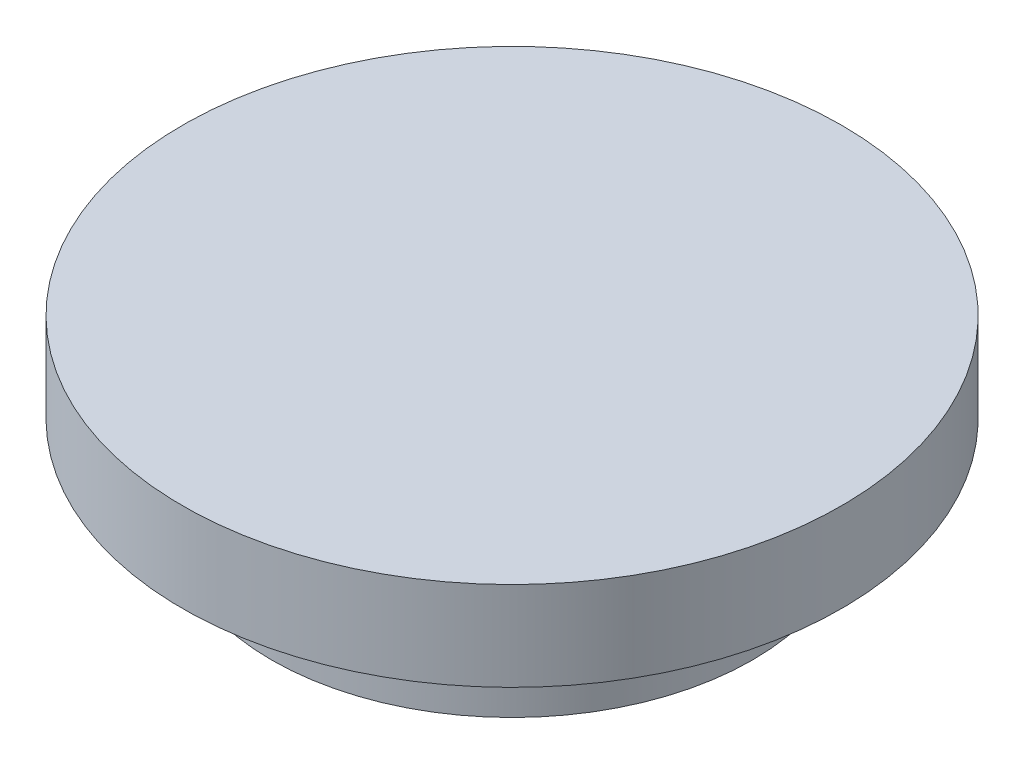
ISO-10303-21;
HEADER;
FILE_DESCRIPTION(('STEP AP214'),'2;1');
FILE_NAME('part.step','',(''),(''),'','','');
FILE_SCHEMA(('AUTOMOTIVE_DESIGN { 1 0 10303 214 1 1 1 1 }'));
ENDSEC;
DATA;
#1=APPLICATION_CONTEXT('core data for automotive mechanical design processes');
#2=APPLICATION_PROTOCOL_DEFINITION('international standard','automotive_design',2000,#1);
#3=PRODUCT_CONTEXT('',#1,'mechanical');
#4=PRODUCT('Part','Part','',(#3));
#5=PRODUCT_RELATED_PRODUCT_CATEGORY('part','',(#4));
#6=PRODUCT_DEFINITION_FORMATION('','',#4);
#7=PRODUCT_DEFINITION_CONTEXT('part definition',#1,'design');
#8=PRODUCT_DEFINITION('design','',#6,#7);
#9=PRODUCT_DEFINITION_SHAPE('','',#8);
#10=(LENGTH_UNIT() NAMED_UNIT(*) SI_UNIT(.MILLI.,.METRE.));
#11=(NAMED_UNIT(*) PLANE_ANGLE_UNIT() SI_UNIT($,.RADIAN.));
#12=(NAMED_UNIT(*) SI_UNIT($,.STERADIAN.) SOLID_ANGLE_UNIT());
#13=UNCERTAINTY_MEASURE_WITH_UNIT(LENGTH_MEASURE(1.E-05),#10,'distance_accuracy_value','');
#14=(GEOMETRIC_REPRESENTATION_CONTEXT(3) GLOBAL_UNCERTAINTY_ASSIGNED_CONTEXT((#13)) GLOBAL_UNIT_ASSIGNED_CONTEXT((#10,
#11,#12)) REPRESENTATION_CONTEXT('',''));
#15=CARTESIAN_POINT('',(0.,0.,0.));
#16=DIRECTION('',(0.,0.,1.));
#17=DIRECTION('',(1.,0.,0.));
#18=AXIS2_PLACEMENT_3D('',#15,#16,#17);
#19=CARTESIAN_POINT('',(0.,0.,0.));
#20=DIRECTION('',(0.,-1.,0.));
#21=DIRECTION('',(0.,0.,-1.));
#22=AXIS2_PLACEMENT_3D('',#19,#20,#21);
#23=PLANE('',#22);
#24=CARTESIAN_POINT('',(0.,0.,0.));
#25=DIRECTION('',(0.,-1.,0.));
#26=DIRECTION('',(0.,0.,-1.));
#27=AXIS2_PLACEMENT_3D('',#24,#25,#26);
#28=CIRCLE('',#27,1.35);
#29=CARTESIAN_POINT('',(0.,0.,-1.35));
#30=VERTEX_POINT('',#29);
#31=EDGE_CURVE('E10',#30,#30,#28,.T.);
#32=ORIENTED_EDGE('',*,*,#31,.T.);
#33=EDGE_LOOP('',(#32));
#34=FACE_BOUND('',#33,.T.);
#35=ADVANCED_FACE('F31',(#34),#23,.T.);
#36=CARTESIAN_POINT('',(0.,0.,0.));
#37=DIRECTION('',(0.,-1.,0.));
#38=DIRECTION('',(0.,0.,-1.));
#39=AXIS2_PLACEMENT_3D('',#36,#37,#38);
#40=CYLINDRICAL_SURFACE('',#39,1.35);
#41=CARTESIAN_POINT('',(0.,0.5,0.));
#42=DIRECTION('',(0.,-1.,0.));
#43=DIRECTION('',(0.,0.,-1.));
#44=AXIS2_PLACEMENT_3D('',#41,#42,#43);
#45=CIRCLE('',#44,1.35);
#46=CARTESIAN_POINT('',(0.,0.5,-1.35));
#47=VERTEX_POINT('',#46);
#48=EDGE_CURVE('E37',#47,#47,#45,.T.);
#49=ORIENTED_EDGE('',*,*,#48,.T.);
#50=EDGE_LOOP('',(#49));
#51=FACE_BOUND('',#50,.T.);
#52=ORIENTED_EDGE('',*,*,#31,.F.);
#53=EDGE_LOOP('',(#52));
#54=FACE_BOUND('',#53,.T.);
#55=ADVANCED_FACE('F63',(#51,#54),#40,.T.);
#56=CARTESIAN_POINT('',(1.35,0.5,0.));
#57=DIRECTION('',(0.,-1.,0.));
#58=DIRECTION('',(0.,0.,-1.));
#59=AXIS2_PLACEMENT_3D('',#56,#57,#58);
#60=PLANE('',#59);
#61=CARTESIAN_POINT('',(0.,0.5,0.));
#62=DIRECTION('',(0.,-1.,0.));
#63=DIRECTION('',(0.,0.,-1.));
#64=AXIS2_PLACEMENT_3D('',#61,#62,#63);
#65=CIRCLE('',#64,1.85);
#66=CARTESIAN_POINT('',(0.,0.5,-1.85));
#67=VERTEX_POINT('',#66);
#68=EDGE_CURVE('E41',#67,#67,#65,.T.);
#69=ORIENTED_EDGE('',*,*,#68,.T.);
#70=EDGE_LOOP('',(#69));
#71=FACE_BOUND('',#70,.T.);
#72=ORIENTED_EDGE('',*,*,#48,.F.);
#73=EDGE_LOOP('',(#72));
#74=FACE_BOUND('',#73,.T.);
#75=ADVANCED_FACE('F60',(#71,#74),#60,.T.);
#76=CARTESIAN_POINT('',(0.,0.,0.));
#77=DIRECTION('',(0.,-1.,0.));
#78=DIRECTION('',(0.,0.,-1.));
#79=AXIS2_PLACEMENT_3D('',#76,#77,#78);
#80=CYLINDRICAL_SURFACE('',#79,1.85);
#81=CARTESIAN_POINT('',(0.,1.,0.));
#82=DIRECTION('',(0.,-1.,0.));
#83=DIRECTION('',(0.,0.,-1.));
#84=AXIS2_PLACEMENT_3D('',#81,#82,#83);
#85=CIRCLE('',#84,1.85);
#86=CARTESIAN_POINT('',(0.,1.,-1.85));
#87=VERTEX_POINT('',#86);
#88=EDGE_CURVE('E45',#87,#87,#85,.T.);
#89=ORIENTED_EDGE('',*,*,#88,.T.);
#90=EDGE_LOOP('',(#89));
#91=FACE_BOUND('',#90,.T.);
#92=ORIENTED_EDGE('',*,*,#68,.F.);
#93=EDGE_LOOP('',(#92));
#94=FACE_BOUND('',#93,.T.);
#95=ADVANCED_FACE('F51',(#91,#94),#80,.T.);
#96=CARTESIAN_POINT('',(1.85,1.,0.));
#97=DIRECTION('',(0.,1.,0.));
#98=DIRECTION('',(0.,0.,1.));
#99=AXIS2_PLACEMENT_3D('',#96,#97,#98);
#100=PLANE('',#99);
#101=ORIENTED_EDGE('',*,*,#88,.F.);
#102=EDGE_LOOP('',(#101));
#103=FACE_BOUND('',#102,.T.);
#104=ADVANCED_FACE('F54',(#103),#100,.T.);
#105=CLOSED_SHELL('',(#35,#55,#75,#95,#104));
#106=MANIFOLD_SOLID_BREP('B2',#105);
#107=ADVANCED_BREP_SHAPE_REPRESENTATION('',(#18,#106),#14);
#108=SHAPE_DEFINITION_REPRESENTATION(#9,#107);
ENDSEC;
END-ISO-10303-21;
